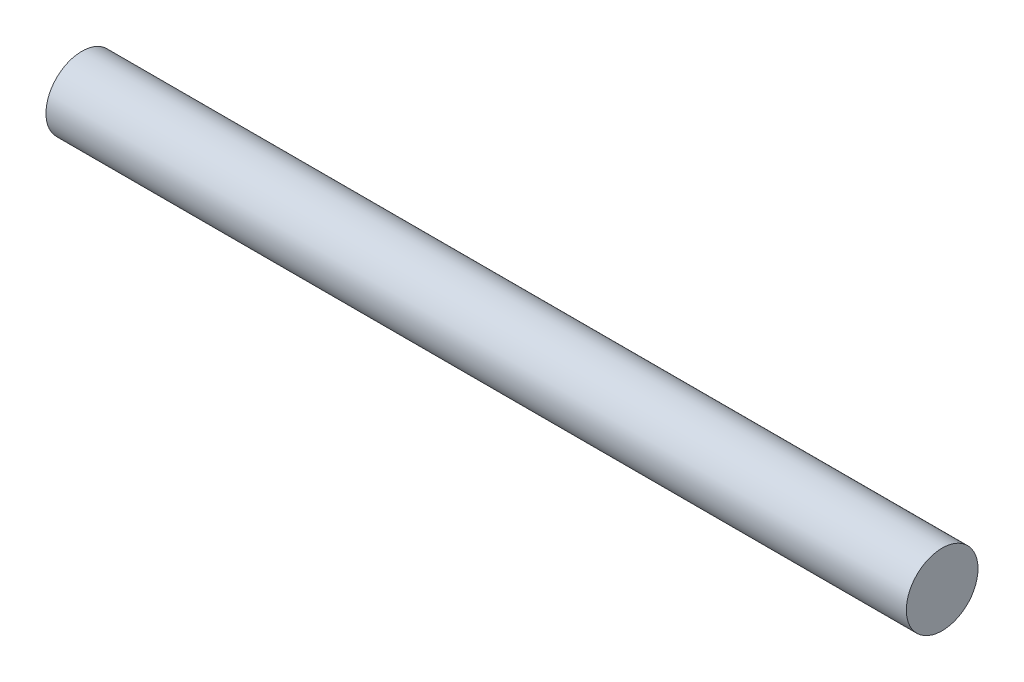
ISO-10303-21;
HEADER;
FILE_DESCRIPTION(('STEP AP214'),'2;1');
FILE_NAME('part.step','',(''),(''),'','','');
FILE_SCHEMA(('AUTOMOTIVE_DESIGN { 1 0 10303 214 1 1 1 1 }'));
ENDSEC;
DATA;
#1=APPLICATION_CONTEXT('core data for automotive mechanical design processes');
#2=APPLICATION_PROTOCOL_DEFINITION('international standard','automotive_design',2000,#1);
#3=PRODUCT_CONTEXT('',#1,'mechanical');
#4=PRODUCT('Part','Part','',(#3));
#5=PRODUCT_RELATED_PRODUCT_CATEGORY('part','',(#4));
#6=PRODUCT_DEFINITION_FORMATION('','',#4);
#7=PRODUCT_DEFINITION_CONTEXT('part definition',#1,'design');
#8=PRODUCT_DEFINITION('design','',#6,#7);
#9=PRODUCT_DEFINITION_SHAPE('','',#8);
#10=(LENGTH_UNIT() NAMED_UNIT(*) SI_UNIT(.MILLI.,.METRE.));
#11=(NAMED_UNIT(*) PLANE_ANGLE_UNIT() SI_UNIT($,.RADIAN.));
#12=(NAMED_UNIT(*) SI_UNIT($,.STERADIAN.) SOLID_ANGLE_UNIT());
#13=UNCERTAINTY_MEASURE_WITH_UNIT(LENGTH_MEASURE(1.E-05),#10,'distance_accuracy_value','');
#14=(GEOMETRIC_REPRESENTATION_CONTEXT(3) GLOBAL_UNCERTAINTY_ASSIGNED_CONTEXT((#13)) GLOBAL_UNIT_ASSIGNED_CONTEXT((#10,
#11,#12)) REPRESENTATION_CONTEXT('',''));
#15=CARTESIAN_POINT('',(0.,0.,0.));
#16=DIRECTION('',(0.,0.,1.));
#17=DIRECTION('',(1.,0.,0.));
#18=AXIS2_PLACEMENT_3D('',#15,#16,#17);
#19=CARTESIAN_POINT('',(12.,0.,0.));
#20=DIRECTION('',(-1.,0.,0.));
#21=DIRECTION('',(0.,0.,1.));
#22=AXIS2_PLACEMENT_3D('',#19,#20,#21);
#23=CYLINDRICAL_SURFACE('',#22,0.5);
#24=CARTESIAN_POINT('',(12.,0.,0.));
#25=DIRECTION('',(1.,0.,0.));
#26=DIRECTION('',(0.,0.,-1.));
#27=AXIS2_PLACEMENT_3D('',#24,#25,#26);
#28=CIRCLE('',#27,0.5);
#29=CARTESIAN_POINT('',(12.,0.,-0.5));
#30=VERTEX_POINT('',#29);
#31=EDGE_CURVE('E10',#30,#30,#28,.T.);
#32=ORIENTED_EDGE('',*,*,#31,.F.);
#33=EDGE_LOOP('',(#32));
#34=FACE_BOUND('',#33,.T.);
#35=CARTESIAN_POINT('',(0.,0.,0.));
#36=DIRECTION('',(1.,0.,0.));
#37=DIRECTION('',(0.,0.,-1.));
#38=AXIS2_PLACEMENT_3D('',#35,#36,#37);
#39=CIRCLE('',#38,0.5);
#40=CARTESIAN_POINT('',(0.,0.,-0.5));
#41=VERTEX_POINT('',#40);
#42=EDGE_CURVE('E38',#41,#41,#39,.T.);
#43=ORIENTED_EDGE('',*,*,#42,.T.);
#44=EDGE_LOOP('',(#43));
#45=FACE_BOUND('',#44,.T.);
#46=ADVANCED_FACE('F35',(#34,#45),#23,.T.);
#47=CARTESIAN_POINT('',(12.,0.,0.));
#48=DIRECTION('',(1.,0.,0.));
#49=DIRECTION('',(0.,0.,-1.));
#50=AXIS2_PLACEMENT_3D('',#47,#48,#49);
#51=PLANE('',#50);
#52=ORIENTED_EDGE('',*,*,#31,.T.);
#53=EDGE_LOOP('',(#52));
#54=FACE_BOUND('',#53,.T.);
#55=ADVANCED_FACE('F50',(#54),#51,.T.);
#56=CARTESIAN_POINT('',(0.,0.,0.));
#57=DIRECTION('',(1.,0.,0.));
#58=DIRECTION('',(0.,0.,-1.));
#59=AXIS2_PLACEMENT_3D('',#56,#57,#58);
#60=PLANE('',#59);
#61=ORIENTED_EDGE('',*,*,#42,.F.);
#62=EDGE_LOOP('',(#61));
#63=FACE_BOUND('',#62,.T.);
#64=ADVANCED_FACE('F48',(#63),#60,.F.);
#65=CLOSED_SHELL('',(#46,#55,#64));
#66=MANIFOLD_SOLID_BREP('B2',#65);
#67=ADVANCED_BREP_SHAPE_REPRESENTATION('',(#18,#66),#14);
#68=SHAPE_DEFINITION_REPRESENTATION(#9,#67);
ENDSEC;
END-ISO-10303-21;
